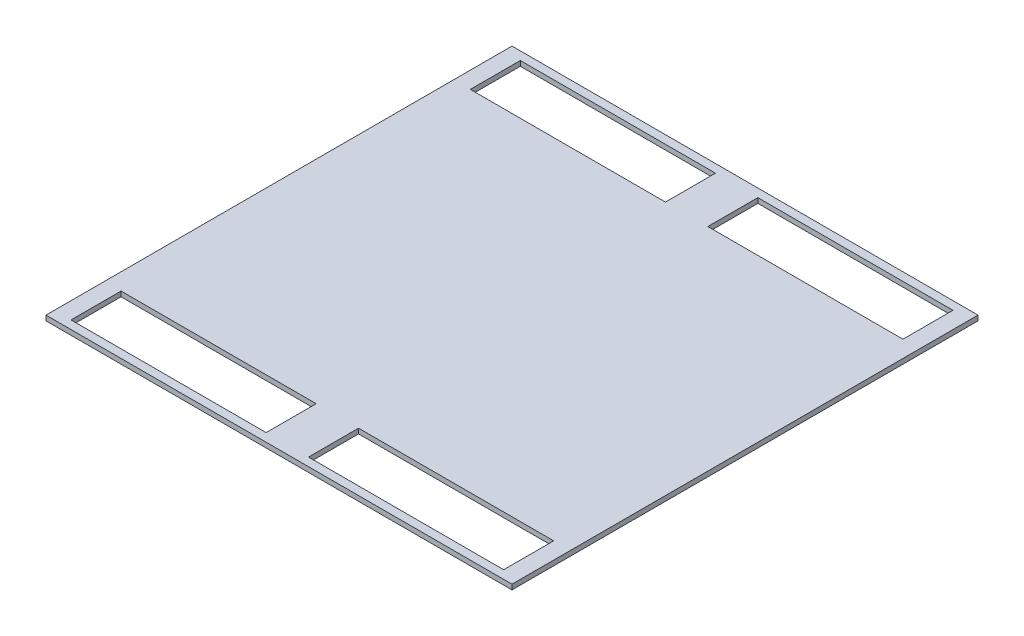
ISO-10303-21;
HEADER;
FILE_DESCRIPTION(('STEP AP214'),'2;1');
FILE_NAME('part.step','',(''),(''),'','','');
FILE_SCHEMA(('AUTOMOTIVE_DESIGN { 1 0 10303 214 1 1 1 1 }'));
ENDSEC;
DATA;
#1=APPLICATION_CONTEXT('core data for automotive mechanical design processes');
#2=APPLICATION_PROTOCOL_DEFINITION('international standard','automotive_design',2000,#1);
#3=PRODUCT_CONTEXT('',#1,'mechanical');
#4=PRODUCT('Part','Part','',(#3));
#5=PRODUCT_RELATED_PRODUCT_CATEGORY('part','',(#4));
#6=PRODUCT_DEFINITION_FORMATION('','',#4);
#7=PRODUCT_DEFINITION_CONTEXT('part definition',#1,'design');
#8=PRODUCT_DEFINITION('design','',#6,#7);
#9=PRODUCT_DEFINITION_SHAPE('','',#8);
#10=(LENGTH_UNIT() NAMED_UNIT(*) SI_UNIT(.MILLI.,.METRE.));
#11=(NAMED_UNIT(*) PLANE_ANGLE_UNIT() SI_UNIT($,.RADIAN.));
#12=(NAMED_UNIT(*) SI_UNIT($,.STERADIAN.) SOLID_ANGLE_UNIT());
#13=UNCERTAINTY_MEASURE_WITH_UNIT(LENGTH_MEASURE(1.E-05),#10,'distance_accuracy_value','');
#14=(GEOMETRIC_REPRESENTATION_CONTEXT(3) GLOBAL_UNCERTAINTY_ASSIGNED_CONTEXT((#13)) GLOBAL_UNIT_ASSIGNED_CONTEXT((#10,
#11,#12)) REPRESENTATION_CONTEXT('',''));
#15=CARTESIAN_POINT('',(0.,0.,0.));
#16=DIRECTION('',(0.,0.,1.));
#17=DIRECTION('',(1.,0.,0.));
#18=AXIS2_PLACEMENT_3D('',#15,#16,#17);
#19=CARTESIAN_POINT('',(0.,3.,0.));
#20=DIRECTION('',(0.,1.,0.));
#21=DIRECTION('',(0.,0.,1.));
#22=AXIS2_PLACEMENT_3D('',#19,#20,#21);
#23=PLANE('',#22);
#24=DIRECTION('',(0.,0.,-1.));
#25=VECTOR('',#24,1.);
#26=CARTESIAN_POINT('',(139.7,3.,-139.7));
#27=LINE('',#26,#25);
#28=CARTESIAN_POINT('',(139.7,3.,139.7));
#29=VERTEX_POINT('',#28);
#30=CARTESIAN_POINT('',(139.7,3.,-139.7));
#31=VERTEX_POINT('',#30);
#32=EDGE_CURVE('E300',#29,#31,#27,.T.);
#33=ORIENTED_EDGE('',*,*,#32,.T.);
#34=DIRECTION('',(-1.,0.,0.));
#35=VECTOR('',#34,1.);
#36=CARTESIAN_POINT('',(-139.7,3.,-139.7));
#37=LINE('',#36,#35);
#38=CARTESIAN_POINT('',(-139.7,3.,-139.7));
#39=VERTEX_POINT('',#38);
#40=EDGE_CURVE('E303',#31,#39,#37,.T.);
#41=ORIENTED_EDGE('',*,*,#40,.T.);
#42=DIRECTION('',(0.,0.,1.));
#43=VECTOR('',#42,1.);
#44=CARTESIAN_POINT('',(-139.7,3.,-139.7));
#45=LINE('',#44,#43);
#46=CARTESIAN_POINT('',(-139.7,3.,139.7));
#47=VERTEX_POINT('',#46);
#48=EDGE_CURVE('E306',#39,#47,#45,.T.);
#49=ORIENTED_EDGE('',*,*,#48,.T.);
#50=DIRECTION('',(1.,0.,0.));
#51=VECTOR('',#50,1.);
#52=CARTESIAN_POINT('',(-139.7,3.,139.7));
#53=LINE('',#52,#51);
#54=EDGE_CURVE('E308',#47,#29,#53,.T.);
#55=ORIENTED_EDGE('',*,*,#54,.T.);
#56=EDGE_LOOP('',(#33,#41,#49,#55));
#57=FACE_BOUND('',#56,.T.);
#58=DIRECTION('',(1.,0.,0.));
#59=VECTOR('',#58,1.);
#60=CARTESIAN_POINT('',(-129.7,3.,-104.7));
#61=LINE('',#60,#59);
#62=CARTESIAN_POINT('',(-129.7,3.,-104.7));
#63=VERTEX_POINT('',#62);
#64=CARTESIAN_POINT('',(-12.7000000000001,3.,-104.7));
#65=VERTEX_POINT('',#64);
#66=EDGE_CURVE('E271',#63,#65,#61,.T.);
#67=ORIENTED_EDGE('',*,*,#66,.F.);
#68=DIRECTION('',(0.,0.,1.));
#69=VECTOR('',#68,1.);
#70=CARTESIAN_POINT('',(-129.7,3.,-134.7));
#71=LINE('',#70,#69);
#72=CARTESIAN_POINT('',(-129.7,3.,-134.7));
#73=VERTEX_POINT('',#72);
#74=EDGE_CURVE('E269',#73,#63,#71,.T.);
#75=ORIENTED_EDGE('',*,*,#74,.F.);
#76=DIRECTION('',(-1.,0.,0.));
#77=VECTOR('',#76,1.);
#78=CARTESIAN_POINT('',(-129.7,3.,-134.7));
#79=LINE('',#78,#77);
#80=CARTESIAN_POINT('',(-12.7000000000001,3.,-134.7));
#81=VERTEX_POINT('',#80);
#82=EDGE_CURVE('E277',#81,#73,#79,.T.);
#83=ORIENTED_EDGE('',*,*,#82,.F.);
#84=DIRECTION('',(0.,0.,-1.));
#85=VECTOR('',#84,1.);
#86=CARTESIAN_POINT('',(-12.7000000000001,3.,-134.7));
#87=LINE('',#86,#85);
#88=EDGE_CURVE('E274',#65,#81,#87,.T.);
#89=ORIENTED_EDGE('',*,*,#88,.F.);
#90=EDGE_LOOP('',(#67,#75,#83,#89));
#91=FACE_BOUND('',#90,.T.);
#92=DIRECTION('',(-1.,0.,0.));
#93=VECTOR('',#92,1.);
#94=CARTESIAN_POINT('',(129.7,3.,-134.7));
#95=LINE('',#94,#93);
#96=CARTESIAN_POINT('',(129.7,3.,-134.7));
#97=VERTEX_POINT('',#96);
#98=CARTESIAN_POINT('',(12.7000000000001,3.,-134.7));
#99=VERTEX_POINT('',#98);
#100=EDGE_CURVE('E240',#97,#99,#95,.T.);
#101=ORIENTED_EDGE('',*,*,#100,.F.);
#102=DIRECTION('',(0.,0.,-1.));
#103=VECTOR('',#102,1.);
#104=CARTESIAN_POINT('',(129.7,3.,-134.7));
#105=LINE('',#104,#103);
#106=CARTESIAN_POINT('',(129.7,3.,-104.7));
#107=VERTEX_POINT('',#106);
#108=EDGE_CURVE('E238',#107,#97,#105,.T.);
#109=ORIENTED_EDGE('',*,*,#108,.F.);
#110=DIRECTION('',(1.,0.,0.));
#111=VECTOR('',#110,1.);
#112=CARTESIAN_POINT('',(129.7,3.,-104.7));
#113=LINE('',#112,#111);
#114=CARTESIAN_POINT('',(12.7000000000001,3.,-104.7));
#115=VERTEX_POINT('',#114);
#116=EDGE_CURVE('E246',#115,#107,#113,.T.);
#117=ORIENTED_EDGE('',*,*,#116,.F.);
#118=DIRECTION('',(0.,0.,1.));
#119=VECTOR('',#118,1.);
#120=CARTESIAN_POINT('',(12.7000000000001,3.,-134.7));
#121=LINE('',#120,#119);
#122=EDGE_CURVE('E243',#99,#115,#121,.T.);
#123=ORIENTED_EDGE('',*,*,#122,.F.);
#124=EDGE_LOOP('',(#101,#109,#117,#123));
#125=FACE_BOUND('',#124,.T.);
#126=DIRECTION('',(0.,0.,-1.));
#127=VECTOR('',#126,1.);
#128=CARTESIAN_POINT('',(129.7,3.,134.7));
#129=LINE('',#128,#127);
#130=CARTESIAN_POINT('',(129.7,3.,134.7));
#131=VERTEX_POINT('',#130);
#132=CARTESIAN_POINT('',(129.7,3.,104.7));
#133=VERTEX_POINT('',#132);
#134=EDGE_CURVE('E209',#131,#133,#129,.T.);
#135=ORIENTED_EDGE('',*,*,#134,.F.);
#136=DIRECTION('',(1.,0.,0.));
#137=VECTOR('',#136,1.);
#138=CARTESIAN_POINT('',(129.7,3.,134.7));
#139=LINE('',#138,#137);
#140=CARTESIAN_POINT('',(12.7000000000001,3.,134.7));
#141=VERTEX_POINT('',#140);
#142=EDGE_CURVE('E207',#141,#131,#139,.T.);
#143=ORIENTED_EDGE('',*,*,#142,.F.);
#144=DIRECTION('',(0.,0.,1.));
#145=VECTOR('',#144,1.);
#146=CARTESIAN_POINT('',(12.7000000000001,3.,134.7));
#147=LINE('',#146,#145);
#148=CARTESIAN_POINT('',(12.7000000000001,3.,104.7));
#149=VERTEX_POINT('',#148);
#150=EDGE_CURVE('E215',#149,#141,#147,.T.);
#151=ORIENTED_EDGE('',*,*,#150,.F.);
#152=DIRECTION('',(-1.,0.,0.));
#153=VECTOR('',#152,1.);
#154=CARTESIAN_POINT('',(129.7,3.,104.7));
#155=LINE('',#154,#153);
#156=EDGE_CURVE('E212',#133,#149,#155,.T.);
#157=ORIENTED_EDGE('',*,*,#156,.F.);
#158=EDGE_LOOP('',(#135,#143,#151,#157));
#159=FACE_BOUND('',#158,.T.);
#160=DIRECTION('',(1.,0.,0.));
#161=VECTOR('',#160,1.);
#162=CARTESIAN_POINT('',(-129.7,3.,134.7));
#163=LINE('',#162,#161);
#164=CARTESIAN_POINT('',(-129.7,3.,134.7));
#165=VERTEX_POINT('',#164);
#166=CARTESIAN_POINT('',(-12.7000000000001,3.,134.7));
#167=VERTEX_POINT('',#166);
#168=EDGE_CURVE('E179',#165,#167,#163,.T.);
#169=ORIENTED_EDGE('',*,*,#168,.F.);
#170=DIRECTION('',(0.,0.,1.));
#171=VECTOR('',#170,1.);
#172=CARTESIAN_POINT('',(-129.7,3.,134.7));
#173=LINE('',#172,#171);
#174=CARTESIAN_POINT('',(-129.7,3.,104.7));
#175=VERTEX_POINT('',#174);
#176=EDGE_CURVE('E171',#175,#165,#173,.T.);
#177=ORIENTED_EDGE('',*,*,#176,.F.);
#178=DIRECTION('',(-1.,0.,0.));
#179=VECTOR('',#178,1.);
#180=CARTESIAN_POINT('',(-129.7,3.,104.7));
#181=LINE('',#180,#179);
#182=CARTESIAN_POINT('',(-12.7000000000001,3.,104.7));
#183=VERTEX_POINT('',#182);
#184=EDGE_CURVE('E193',#183,#175,#181,.T.);
#185=ORIENTED_EDGE('',*,*,#184,.F.);
#186=DIRECTION('',(0.,0.,-1.));
#187=VECTOR('',#186,1.);
#188=CARTESIAN_POINT('',(-12.7000000000001,3.,134.7));
#189=LINE('',#188,#187);
#190=EDGE_CURVE('E191',#167,#183,#189,.T.);
#191=ORIENTED_EDGE('',*,*,#190,.F.);
#192=EDGE_LOOP('',(#169,#177,#185,#191));
#193=FACE_BOUND('',#192,.T.);
#194=ADVANCED_FACE('F34',(#57,#91,#125,#159,#193),#23,.T.);
#195=CARTESIAN_POINT('',(0.,0.,0.));
#196=DIRECTION('',(0.,1.,0.));
#197=DIRECTION('',(0.,0.,1.));
#198=AXIS2_PLACEMENT_3D('',#195,#196,#197);
#199=PLANE('',#198);
#200=DIRECTION('',(1.,0.,0.));
#201=VECTOR('',#200,1.);
#202=CARTESIAN_POINT('',(129.7,0.,134.7));
#203=LINE('',#202,#201);
#204=CARTESIAN_POINT('',(12.7000000000001,0.,134.7));
#205=VERTEX_POINT('',#204);
#206=CARTESIAN_POINT('',(129.7,0.,134.7));
#207=VERTEX_POINT('',#206);
#208=EDGE_CURVE('E187',#205,#207,#203,.T.);
#209=ORIENTED_EDGE('',*,*,#208,.T.);
#210=DIRECTION('',(0.,0.,-1.));
#211=VECTOR('',#210,1.);
#212=CARTESIAN_POINT('',(129.7,0.,134.7));
#213=LINE('',#212,#211);
#214=CARTESIAN_POINT('',(129.7,0.,104.7));
#215=VERTEX_POINT('',#214);
#216=EDGE_CURVE('E220',#207,#215,#213,.T.);
#217=ORIENTED_EDGE('',*,*,#216,.T.);
#218=DIRECTION('',(-1.,0.,0.));
#219=VECTOR('',#218,1.);
#220=CARTESIAN_POINT('',(129.7,0.,104.7));
#221=LINE('',#220,#219);
#222=CARTESIAN_POINT('',(12.7000000000001,0.,104.7));
#223=VERTEX_POINT('',#222);
#224=EDGE_CURVE('E223',#215,#223,#221,.T.);
#225=ORIENTED_EDGE('',*,*,#224,.T.);
#226=DIRECTION('',(0.,0.,1.));
#227=VECTOR('',#226,1.);
#228=CARTESIAN_POINT('',(12.7000000000001,0.,134.7));
#229=LINE('',#228,#227);
#230=EDGE_CURVE('E210',#223,#205,#229,.T.);
#231=ORIENTED_EDGE('',*,*,#230,.T.);
#232=EDGE_LOOP('',(#209,#217,#225,#231));
#233=FACE_BOUND('',#232,.T.);
#234=DIRECTION('',(0.,0.,1.));
#235=VECTOR('',#234,1.);
#236=CARTESIAN_POINT('',(-129.7,0.,-134.7));
#237=LINE('',#236,#235);
#238=CARTESIAN_POINT('',(-129.7,0.,-134.7));
#239=VERTEX_POINT('',#238);
#240=CARTESIAN_POINT('',(-129.7,0.,-104.7));
#241=VERTEX_POINT('',#240);
#242=EDGE_CURVE('E268',#239,#241,#237,.T.);
#243=ORIENTED_EDGE('',*,*,#242,.T.);
#244=DIRECTION('',(1.,0.,0.));
#245=VECTOR('',#244,1.);
#246=CARTESIAN_POINT('',(-129.7,0.,-104.7));
#247=LINE('',#246,#245);
#248=CARTESIAN_POINT('',(-12.7000000000001,0.,-104.7));
#249=VERTEX_POINT('',#248);
#250=EDGE_CURVE('E282',#241,#249,#247,.T.);
#251=ORIENTED_EDGE('',*,*,#250,.T.);
#252=DIRECTION('',(0.,0.,-1.));
#253=VECTOR('',#252,1.);
#254=CARTESIAN_POINT('',(-12.7000000000001,0.,-134.7));
#255=LINE('',#254,#253);
#256=CARTESIAN_POINT('',(-12.7000000000001,0.,-134.7));
#257=VERTEX_POINT('',#256);
#258=EDGE_CURVE('E285',#249,#257,#255,.T.);
#259=ORIENTED_EDGE('',*,*,#258,.T.);
#260=DIRECTION('',(-1.,0.,0.));
#261=VECTOR('',#260,1.);
#262=CARTESIAN_POINT('',(-129.7,0.,-134.7));
#263=LINE('',#262,#261);
#264=EDGE_CURVE('E272',#257,#239,#263,.T.);
#265=ORIENTED_EDGE('',*,*,#264,.T.);
#266=EDGE_LOOP('',(#243,#251,#259,#265));
#267=FACE_BOUND('',#266,.T.);
#268=DIRECTION('',(0.,0.,-1.));
#269=VECTOR('',#268,1.);
#270=CARTESIAN_POINT('',(139.7,0.,-139.7));
#271=LINE('',#270,#269);
#272=CARTESIAN_POINT('',(139.7,0.,139.7));
#273=VERTEX_POINT('',#272);
#274=CARTESIAN_POINT('',(139.7,0.,-139.7));
#275=VERTEX_POINT('',#274);
#276=EDGE_CURVE('E299',#273,#275,#271,.T.);
#277=ORIENTED_EDGE('',*,*,#276,.F.);
#278=DIRECTION('',(1.,0.,0.));
#279=VECTOR('',#278,1.);
#280=CARTESIAN_POINT('',(-139.7,0.,139.7));
#281=LINE('',#280,#279);
#282=CARTESIAN_POINT('',(-139.7,0.,139.7));
#283=VERTEX_POINT('',#282);
#284=EDGE_CURVE('E304',#283,#273,#281,.T.);
#285=ORIENTED_EDGE('',*,*,#284,.F.);
#286=DIRECTION('',(0.,0.,1.));
#287=VECTOR('',#286,1.);
#288=CARTESIAN_POINT('',(-139.7,0.,-139.7));
#289=LINE('',#288,#287);
#290=CARTESIAN_POINT('',(-139.7,0.,-139.7));
#291=VERTEX_POINT('',#290);
#292=EDGE_CURVE('E315',#291,#283,#289,.T.);
#293=ORIENTED_EDGE('',*,*,#292,.F.);
#294=DIRECTION('',(-1.,0.,0.));
#295=VECTOR('',#294,1.);
#296=CARTESIAN_POINT('',(-139.7,0.,-139.7));
#297=LINE('',#296,#295);
#298=EDGE_CURVE('E313',#275,#291,#297,.T.);
#299=ORIENTED_EDGE('',*,*,#298,.F.);
#300=EDGE_LOOP('',(#277,#285,#293,#299));
#301=FACE_BOUND('',#300,.T.);
#302=DIRECTION('',(0.,0.,-1.));
#303=VECTOR('',#302,1.);
#304=CARTESIAN_POINT('',(129.7,0.,-134.7));
#305=LINE('',#304,#303);
#306=CARTESIAN_POINT('',(129.7,0.,-104.7));
#307=VERTEX_POINT('',#306);
#308=CARTESIAN_POINT('',(129.7,0.,-134.7));
#309=VERTEX_POINT('',#308);
#310=EDGE_CURVE('E237',#307,#309,#305,.T.);
#311=ORIENTED_EDGE('',*,*,#310,.T.);
#312=DIRECTION('',(-1.,0.,0.));
#313=VECTOR('',#312,1.);
#314=CARTESIAN_POINT('',(129.7,0.,-134.7));
#315=LINE('',#314,#313);
#316=CARTESIAN_POINT('',(12.7000000000001,0.,-134.7));
#317=VERTEX_POINT('',#316);
#318=EDGE_CURVE('E251',#309,#317,#315,.T.);
#319=ORIENTED_EDGE('',*,*,#318,.T.);
#320=DIRECTION('',(0.,0.,1.));
#321=VECTOR('',#320,1.);
#322=CARTESIAN_POINT('',(12.7000000000001,0.,-134.7));
#323=LINE('',#322,#321);
#324=CARTESIAN_POINT('',(12.7000000000001,0.,-104.7));
#325=VERTEX_POINT('',#324);
#326=EDGE_CURVE('E254',#317,#325,#323,.T.);
#327=ORIENTED_EDGE('',*,*,#326,.T.);
#328=DIRECTION('',(1.,0.,0.));
#329=VECTOR('',#328,1.);
#330=CARTESIAN_POINT('',(129.7,0.,-104.7));
#331=LINE('',#330,#329);
#332=EDGE_CURVE('E241',#325,#307,#331,.T.);
#333=ORIENTED_EDGE('',*,*,#332,.T.);
#334=EDGE_LOOP('',(#311,#319,#327,#333));
#335=FACE_BOUND('',#334,.T.);
#336=DIRECTION('',(0.,0.,1.));
#337=VECTOR('',#336,1.);
#338=CARTESIAN_POINT('',(-129.7,0.,134.7));
#339=LINE('',#338,#337);
#340=CARTESIAN_POINT('',(-129.7,0.,104.7));
#341=VERTEX_POINT('',#340);
#342=CARTESIAN_POINT('',(-129.7,0.,134.7));
#343=VERTEX_POINT('',#342);
#344=EDGE_CURVE('E57',#341,#343,#339,.T.);
#345=ORIENTED_EDGE('',*,*,#344,.T.);
#346=DIRECTION('',(1.,0.,0.));
#347=VECTOR('',#346,1.);
#348=CARTESIAN_POINT('',(-129.7,0.,134.7));
#349=LINE('',#348,#347);
#350=CARTESIAN_POINT('',(-12.7000000000001,0.,134.7));
#351=VERTEX_POINT('',#350);
#352=EDGE_CURVE('E186',#343,#351,#349,.T.);
#353=ORIENTED_EDGE('',*,*,#352,.T.);
#354=DIRECTION('',(0.,0.,-1.));
#355=VECTOR('',#354,1.);
#356=CARTESIAN_POINT('',(-12.7000000000001,0.,134.7));
#357=LINE('',#356,#355);
#358=CARTESIAN_POINT('',(-12.7000000000001,0.,104.7));
#359=VERTEX_POINT('',#358);
#360=EDGE_CURVE('E199',#351,#359,#357,.T.);
#361=ORIENTED_EDGE('',*,*,#360,.T.);
#362=DIRECTION('',(-1.,0.,0.));
#363=VECTOR('',#362,1.);
#364=CARTESIAN_POINT('',(-129.7,0.,104.7));
#365=LINE('',#364,#363);
#366=EDGE_CURVE('E180',#359,#341,#365,.T.);
#367=ORIENTED_EDGE('',*,*,#366,.T.);
#368=EDGE_LOOP('',(#345,#353,#361,#367));
#369=FACE_BOUND('',#368,.T.);
#370=ADVANCED_FACE('F333',(#233,#267,#301,#335,#369),#199,.F.);
#371=CARTESIAN_POINT('',(139.7,3.,-139.7));
#372=DIRECTION('',(-1.,0.,0.));
#373=DIRECTION('',(0.,0.,1.));
#374=AXIS2_PLACEMENT_3D('',#371,#372,#373);
#375=PLANE('',#374);
#376=ORIENTED_EDGE('',*,*,#276,.T.);
#377=DIRECTION('',(0.,-1.,0.));
#378=VECTOR('',#377,1.);
#379=CARTESIAN_POINT('',(139.7,3.,-139.7));
#380=LINE('',#379,#378);
#381=EDGE_CURVE('E11',#31,#275,#380,.T.);
#382=ORIENTED_EDGE('',*,*,#381,.F.);
#383=ORIENTED_EDGE('',*,*,#32,.F.);
#384=DIRECTION('',(0.,-1.,0.));
#385=VECTOR('',#384,1.);
#386=CARTESIAN_POINT('',(139.7,3.,139.7));
#387=LINE('',#386,#385);
#388=EDGE_CURVE('E310',#29,#273,#387,.T.);
#389=ORIENTED_EDGE('',*,*,#388,.T.);
#390=EDGE_LOOP('',(#376,#382,#383,#389));
#391=FACE_BOUND('',#390,.T.);
#392=ADVANCED_FACE('F36',(#391),#375,.F.);
#393=CARTESIAN_POINT('',(-139.7,3.,-139.7));
#394=DIRECTION('',(0.,0.,1.));
#395=DIRECTION('',(1.,0.,0.));
#396=AXIS2_PLACEMENT_3D('',#393,#394,#395);
#397=PLANE('',#396);
#398=ORIENTED_EDGE('',*,*,#298,.T.);
#399=DIRECTION('',(0.,-1.,0.));
#400=VECTOR('',#399,1.);
#401=CARTESIAN_POINT('',(-139.7,3.,-139.7));
#402=LINE('',#401,#400);
#403=EDGE_CURVE('E42',#39,#291,#402,.T.);
#404=ORIENTED_EDGE('',*,*,#403,.F.);
#405=ORIENTED_EDGE('',*,*,#40,.F.);
#406=ORIENTED_EDGE('',*,*,#381,.T.);
#407=EDGE_LOOP('',(#398,#404,#405,#406));
#408=FACE_BOUND('',#407,.T.);
#409=ADVANCED_FACE('F344',(#408),#397,.F.);
#410=CARTESIAN_POINT('',(-139.7,3.,-139.7));
#411=DIRECTION('',(1.,0.,0.));
#412=DIRECTION('',(0.,0.,-1.));
#413=AXIS2_PLACEMENT_3D('',#410,#411,#412);
#414=PLANE('',#413);
#415=ORIENTED_EDGE('',*,*,#292,.T.);
#416=DIRECTION('',(0.,-1.,0.));
#417=VECTOR('',#416,1.);
#418=CARTESIAN_POINT('',(-139.7,3.,139.7));
#419=LINE('',#418,#417);
#420=EDGE_CURVE('E320',#47,#283,#419,.T.);
#421=ORIENTED_EDGE('',*,*,#420,.F.);
#422=ORIENTED_EDGE('',*,*,#48,.F.);
#423=ORIENTED_EDGE('',*,*,#403,.T.);
#424=EDGE_LOOP('',(#415,#421,#422,#423));
#425=FACE_BOUND('',#424,.T.);
#426=ADVANCED_FACE('F327',(#425),#414,.F.);
#427=CARTESIAN_POINT('',(-139.7,3.,139.7));
#428=DIRECTION('',(0.,0.,-1.));
#429=DIRECTION('',(-1.,0.,0.));
#430=AXIS2_PLACEMENT_3D('',#427,#428,#429);
#431=PLANE('',#430);
#432=ORIENTED_EDGE('',*,*,#284,.T.);
#433=ORIENTED_EDGE('',*,*,#388,.F.);
#434=ORIENTED_EDGE('',*,*,#54,.F.);
#435=ORIENTED_EDGE('',*,*,#420,.T.);
#436=EDGE_LOOP('',(#432,#433,#434,#435));
#437=FACE_BOUND('',#436,.T.);
#438=ADVANCED_FACE('F337',(#437),#431,.F.);
#439=CARTESIAN_POINT('',(-129.7,3.,-134.7));
#440=DIRECTION('',(1.,0.,0.));
#441=DIRECTION('',(0.,0.,-1.));
#442=AXIS2_PLACEMENT_3D('',#439,#440,#441);
#443=PLANE('',#442);
#444=ORIENTED_EDGE('',*,*,#242,.F.);
#445=DIRECTION('',(0.,-1.,0.));
#446=VECTOR('',#445,1.);
#447=CARTESIAN_POINT('',(-129.7,3.,-134.7));
#448=LINE('',#447,#446);
#449=EDGE_CURVE('E279',#73,#239,#448,.T.);
#450=ORIENTED_EDGE('',*,*,#449,.F.);
#451=ORIENTED_EDGE('',*,*,#74,.T.);
#452=DIRECTION('',(0.,-1.,0.));
#453=VECTOR('',#452,1.);
#454=CARTESIAN_POINT('',(-129.7,3.,-104.7));
#455=LINE('',#454,#453);
#456=EDGE_CURVE('E296',#63,#241,#455,.T.);
#457=ORIENTED_EDGE('',*,*,#456,.T.);
#458=EDGE_LOOP('',(#444,#450,#451,#457));
#459=FACE_BOUND('',#458,.T.);
#460=ADVANCED_FACE('F359',(#459),#443,.T.);
#461=CARTESIAN_POINT('',(-129.7,3.,-104.7));
#462=DIRECTION('',(0.,0.,-1.));
#463=DIRECTION('',(-1.,0.,0.));
#464=AXIS2_PLACEMENT_3D('',#461,#462,#463);
#465=PLANE('',#464);
#466=ORIENTED_EDGE('',*,*,#250,.F.);
#467=ORIENTED_EDGE('',*,*,#456,.F.);
#468=ORIENTED_EDGE('',*,*,#66,.T.);
#469=DIRECTION('',(0.,-1.,0.));
#470=VECTOR('',#469,1.);
#471=CARTESIAN_POINT('',(-12.7000000000001,3.,-104.7));
#472=LINE('',#471,#470);
#473=EDGE_CURVE('E294',#65,#249,#472,.T.);
#474=ORIENTED_EDGE('',*,*,#473,.T.);
#475=EDGE_LOOP('',(#466,#467,#468,#474));
#476=FACE_BOUND('',#475,.T.);
#477=ADVANCED_FACE('F366',(#476),#465,.T.);
#478=CARTESIAN_POINT('',(-12.7000000000001,3.,-134.7));
#479=DIRECTION('',(-1.,0.,0.));
#480=DIRECTION('',(0.,0.,1.));
#481=AXIS2_PLACEMENT_3D('',#478,#479,#480);
#482=PLANE('',#481);
#483=ORIENTED_EDGE('',*,*,#258,.F.);
#484=ORIENTED_EDGE('',*,*,#473,.F.);
#485=ORIENTED_EDGE('',*,*,#88,.T.);
#486=DIRECTION('',(0.,-1.,0.));
#487=VECTOR('',#486,1.);
#488=CARTESIAN_POINT('',(-12.7000000000001,3.,-134.7));
#489=LINE('',#488,#487);
#490=EDGE_CURVE('E292',#81,#257,#489,.T.);
#491=ORIENTED_EDGE('',*,*,#490,.T.);
#492=EDGE_LOOP('',(#483,#484,#485,#491));
#493=FACE_BOUND('',#492,.T.);
#494=ADVANCED_FACE('F371',(#493),#482,.T.);
#495=CARTESIAN_POINT('',(-129.7,3.,-134.7));
#496=DIRECTION('',(0.,0.,1.));
#497=DIRECTION('',(1.,0.,0.));
#498=AXIS2_PLACEMENT_3D('',#495,#496,#497);
#499=PLANE('',#498);
#500=ORIENTED_EDGE('',*,*,#264,.F.);
#501=ORIENTED_EDGE('',*,*,#490,.F.);
#502=ORIENTED_EDGE('',*,*,#82,.T.);
#503=ORIENTED_EDGE('',*,*,#449,.T.);
#504=EDGE_LOOP('',(#500,#501,#502,#503));
#505=FACE_BOUND('',#504,.T.);
#506=ADVANCED_FACE('F379',(#505),#499,.T.);
#507=CARTESIAN_POINT('',(129.7,3.,-134.7));
#508=DIRECTION('',(-1.,0.,0.));
#509=DIRECTION('',(0.,0.,1.));
#510=AXIS2_PLACEMENT_3D('',#507,#508,#509);
#511=PLANE('',#510);
#512=ORIENTED_EDGE('',*,*,#310,.F.);
#513=DIRECTION('',(0.,-1.,0.));
#514=VECTOR('',#513,1.);
#515=CARTESIAN_POINT('',(129.7,3.,-104.7));
#516=LINE('',#515,#514);
#517=EDGE_CURVE('E248',#107,#307,#516,.T.);
#518=ORIENTED_EDGE('',*,*,#517,.F.);
#519=ORIENTED_EDGE('',*,*,#108,.T.);
#520=DIRECTION('',(0.,-1.,0.));
#521=VECTOR('',#520,1.);
#522=CARTESIAN_POINT('',(129.7,3.,-134.7));
#523=LINE('',#522,#521);
#524=EDGE_CURVE('E265',#97,#309,#523,.T.);
#525=ORIENTED_EDGE('',*,*,#524,.T.);
#526=EDGE_LOOP('',(#512,#518,#519,#525));
#527=FACE_BOUND('',#526,.T.);
#528=ADVANCED_FACE('F433',(#527),#511,.T.);
#529=CARTESIAN_POINT('',(129.7,3.,-134.7));
#530=DIRECTION('',(0.,0.,1.));
#531=DIRECTION('',(1.,0.,0.));
#532=AXIS2_PLACEMENT_3D('',#529,#530,#531);
#533=PLANE('',#532);
#534=ORIENTED_EDGE('',*,*,#318,.F.);
#535=ORIENTED_EDGE('',*,*,#524,.F.);
#536=ORIENTED_EDGE('',*,*,#100,.T.);
#537=DIRECTION('',(0.,-1.,0.));
#538=VECTOR('',#537,1.);
#539=CARTESIAN_POINT('',(12.7000000000001,3.,-134.7));
#540=LINE('',#539,#538);
#541=EDGE_CURVE('E263',#99,#317,#540,.T.);
#542=ORIENTED_EDGE('',*,*,#541,.T.);
#543=EDGE_LOOP('',(#534,#535,#536,#542));
#544=FACE_BOUND('',#543,.T.);
#545=ADVANCED_FACE('F429',(#544),#533,.T.);
#546=CARTESIAN_POINT('',(12.7000000000001,3.,-134.7));
#547=DIRECTION('',(1.,0.,0.));
#548=DIRECTION('',(0.,0.,-1.));
#549=AXIS2_PLACEMENT_3D('',#546,#547,#548);
#550=PLANE('',#549);
#551=ORIENTED_EDGE('',*,*,#326,.F.);
#552=ORIENTED_EDGE('',*,*,#541,.F.);
#553=ORIENTED_EDGE('',*,*,#122,.T.);
#554=DIRECTION('',(0.,-1.,0.));
#555=VECTOR('',#554,1.);
#556=CARTESIAN_POINT('',(12.7000000000001,3.,-104.7));
#557=LINE('',#556,#555);
#558=EDGE_CURVE('E261',#115,#325,#557,.T.);
#559=ORIENTED_EDGE('',*,*,#558,.T.);
#560=EDGE_LOOP('',(#551,#552,#553,#559));
#561=FACE_BOUND('',#560,.T.);
#562=ADVANCED_FACE('F425',(#561),#550,.T.);
#563=CARTESIAN_POINT('',(129.7,3.,-104.7));
#564=DIRECTION('',(0.,0.,-1.));
#565=DIRECTION('',(-1.,0.,0.));
#566=AXIS2_PLACEMENT_3D('',#563,#564,#565);
#567=PLANE('',#566);
#568=ORIENTED_EDGE('',*,*,#332,.F.);
#569=ORIENTED_EDGE('',*,*,#558,.F.);
#570=ORIENTED_EDGE('',*,*,#116,.T.);
#571=ORIENTED_EDGE('',*,*,#517,.T.);
#572=EDGE_LOOP('',(#568,#569,#570,#571));
#573=FACE_BOUND('',#572,.T.);
#574=ADVANCED_FACE('F422',(#573),#567,.T.);
#575=CARTESIAN_POINT('',(129.7,3.,134.7));
#576=DIRECTION('',(0.,0.,-1.));
#577=DIRECTION('',(-1.,0.,0.));
#578=AXIS2_PLACEMENT_3D('',#575,#576,#577);
#579=PLANE('',#578);
#580=ORIENTED_EDGE('',*,*,#208,.F.);
#581=DIRECTION('',(0.,-1.,0.));
#582=VECTOR('',#581,1.);
#583=CARTESIAN_POINT('',(12.7000000000001,3.,134.7));
#584=LINE('',#583,#582);
#585=EDGE_CURVE('E217',#141,#205,#584,.T.);
#586=ORIENTED_EDGE('',*,*,#585,.F.);
#587=ORIENTED_EDGE('',*,*,#142,.T.);
#588=DIRECTION('',(0.,-1.,0.));
#589=VECTOR('',#588,1.);
#590=CARTESIAN_POINT('',(129.7,3.,134.7));
#591=LINE('',#590,#589);
#592=EDGE_CURVE('E234',#131,#207,#591,.T.);
#593=ORIENTED_EDGE('',*,*,#592,.T.);
#594=EDGE_LOOP('',(#580,#586,#587,#593));
#595=FACE_BOUND('',#594,.T.);
#596=ADVANCED_FACE('F404',(#595),#579,.T.);
#597=CARTESIAN_POINT('',(129.7,3.,134.7));
#598=DIRECTION('',(-1.,0.,0.));
#599=DIRECTION('',(0.,0.,1.));
#600=AXIS2_PLACEMENT_3D('',#597,#598,#599);
#601=PLANE('',#600);
#602=ORIENTED_EDGE('',*,*,#216,.F.);
#603=ORIENTED_EDGE('',*,*,#592,.F.);
#604=ORIENTED_EDGE('',*,*,#134,.T.);
#605=DIRECTION('',(0.,-1.,0.));
#606=VECTOR('',#605,1.);
#607=CARTESIAN_POINT('',(129.7,3.,104.7));
#608=LINE('',#607,#606);
#609=EDGE_CURVE('E232',#133,#215,#608,.T.);
#610=ORIENTED_EDGE('',*,*,#609,.T.);
#611=EDGE_LOOP('',(#602,#603,#604,#610));
#612=FACE_BOUND('',#611,.T.);
#613=ADVANCED_FACE('F398',(#612),#601,.T.);
#614=CARTESIAN_POINT('',(129.7,3.,104.7));
#615=DIRECTION('',(0.,0.,1.));
#616=DIRECTION('',(1.,0.,0.));
#617=AXIS2_PLACEMENT_3D('',#614,#615,#616);
#618=PLANE('',#617);
#619=ORIENTED_EDGE('',*,*,#224,.F.);
#620=ORIENTED_EDGE('',*,*,#609,.F.);
#621=ORIENTED_EDGE('',*,*,#156,.T.);
#622=DIRECTION('',(0.,-1.,0.));
#623=VECTOR('',#622,1.);
#624=CARTESIAN_POINT('',(12.7000000000001,3.,104.7));
#625=LINE('',#624,#623);
#626=EDGE_CURVE('E230',#149,#223,#625,.T.);
#627=ORIENTED_EDGE('',*,*,#626,.T.);
#628=EDGE_LOOP('',(#619,#620,#621,#627));
#629=FACE_BOUND('',#628,.T.);
#630=ADVANCED_FACE('F401',(#629),#618,.T.);
#631=CARTESIAN_POINT('',(12.7000000000001,3.,134.7));
#632=DIRECTION('',(1.,0.,0.));
#633=DIRECTION('',(0.,0.,-1.));
#634=AXIS2_PLACEMENT_3D('',#631,#632,#633);
#635=PLANE('',#634);
#636=ORIENTED_EDGE('',*,*,#230,.F.);
#637=ORIENTED_EDGE('',*,*,#626,.F.);
#638=ORIENTED_EDGE('',*,*,#150,.T.);
#639=ORIENTED_EDGE('',*,*,#585,.T.);
#640=EDGE_LOOP('',(#636,#637,#638,#639));
#641=FACE_BOUND('',#640,.T.);
#642=ADVANCED_FACE('F407',(#641),#635,.T.);
#643=CARTESIAN_POINT('',(-129.7,3.,134.7));
#644=DIRECTION('',(1.,0.,0.));
#645=DIRECTION('',(0.,0.,-1.));
#646=AXIS2_PLACEMENT_3D('',#643,#644,#645);
#647=PLANE('',#646);
#648=ORIENTED_EDGE('',*,*,#344,.F.);
#649=DIRECTION('',(0.,-1.,0.));
#650=VECTOR('',#649,1.);
#651=CARTESIAN_POINT('',(-129.7,3.,104.7));
#652=LINE('',#651,#650);
#653=EDGE_CURVE('E175',#175,#341,#652,.T.);
#654=ORIENTED_EDGE('',*,*,#653,.F.);
#655=ORIENTED_EDGE('',*,*,#176,.T.);
#656=DIRECTION('',(0.,-1.,0.));
#657=VECTOR('',#656,1.);
#658=CARTESIAN_POINT('',(-129.7,3.,134.7));
#659=LINE('',#658,#657);
#660=EDGE_CURVE('E174',#165,#343,#659,.T.);
#661=ORIENTED_EDGE('',*,*,#660,.T.);
#662=EDGE_LOOP('',(#648,#654,#655,#661));
#663=FACE_BOUND('',#662,.T.);
#664=ADVANCED_FACE('F173',(#663),#647,.T.);
#665=CARTESIAN_POINT('',(-129.7,3.,134.7));
#666=DIRECTION('',(0.,0.,-1.));
#667=DIRECTION('',(-1.,0.,0.));
#668=AXIS2_PLACEMENT_3D('',#665,#666,#667);
#669=PLANE('',#668);
#670=ORIENTED_EDGE('',*,*,#352,.F.);
#671=ORIENTED_EDGE('',*,*,#660,.F.);
#672=ORIENTED_EDGE('',*,*,#168,.T.);
#673=DIRECTION('',(0.,-1.,0.));
#674=VECTOR('',#673,1.);
#675=CARTESIAN_POINT('',(-12.7000000000001,3.,134.7));
#676=LINE('',#675,#674);
#677=EDGE_CURVE('E188',#167,#351,#676,.T.);
#678=ORIENTED_EDGE('',*,*,#677,.T.);
#679=EDGE_LOOP('',(#670,#671,#672,#678));
#680=FACE_BOUND('',#679,.T.);
#681=ADVANCED_FACE('F183',(#680),#669,.T.);
#682=CARTESIAN_POINT('',(-12.7000000000001,3.,134.7));
#683=DIRECTION('',(-1.,0.,0.));
#684=DIRECTION('',(0.,0.,1.));
#685=AXIS2_PLACEMENT_3D('',#682,#683,#684);
#686=PLANE('',#685);
#687=ORIENTED_EDGE('',*,*,#360,.F.);
#688=ORIENTED_EDGE('',*,*,#677,.F.);
#689=ORIENTED_EDGE('',*,*,#190,.T.);
#690=DIRECTION('',(0.,-1.,0.));
#691=VECTOR('',#690,1.);
#692=CARTESIAN_POINT('',(-12.7000000000001,3.,104.7));
#693=LINE('',#692,#691);
#694=EDGE_CURVE('E49',#183,#359,#693,.T.);
#695=ORIENTED_EDGE('',*,*,#694,.T.);
#696=EDGE_LOOP('',(#687,#688,#689,#695));
#697=FACE_BOUND('',#696,.T.);
#698=ADVANCED_FACE('F496',(#697),#686,.T.);
#699=CARTESIAN_POINT('',(-129.7,3.,104.7));
#700=DIRECTION('',(0.,0.,1.));
#701=DIRECTION('',(1.,0.,0.));
#702=AXIS2_PLACEMENT_3D('',#699,#700,#701);
#703=PLANE('',#702);
#704=ORIENTED_EDGE('',*,*,#366,.F.);
#705=ORIENTED_EDGE('',*,*,#694,.F.);
#706=ORIENTED_EDGE('',*,*,#184,.T.);
#707=ORIENTED_EDGE('',*,*,#653,.T.);
#708=EDGE_LOOP('',(#704,#705,#706,#707));
#709=FACE_BOUND('',#708,.T.);
#710=ADVANCED_FACE('F504',(#709),#703,.T.);
#711=CLOSED_SHELL('',(#194,#370,#392,#409,#426,#438,#460,#477,#494,#506,#528,#545,#562,#574,
#596,#613,#630,#642,#664,#681,#698,#710));
#712=MANIFOLD_SOLID_BREP('B2',#711);
#713=ADVANCED_BREP_SHAPE_REPRESENTATION('',(#18,#712),#14);
#714=SHAPE_DEFINITION_REPRESENTATION(#9,#713);
ENDSEC;
END-ISO-10303-21;
